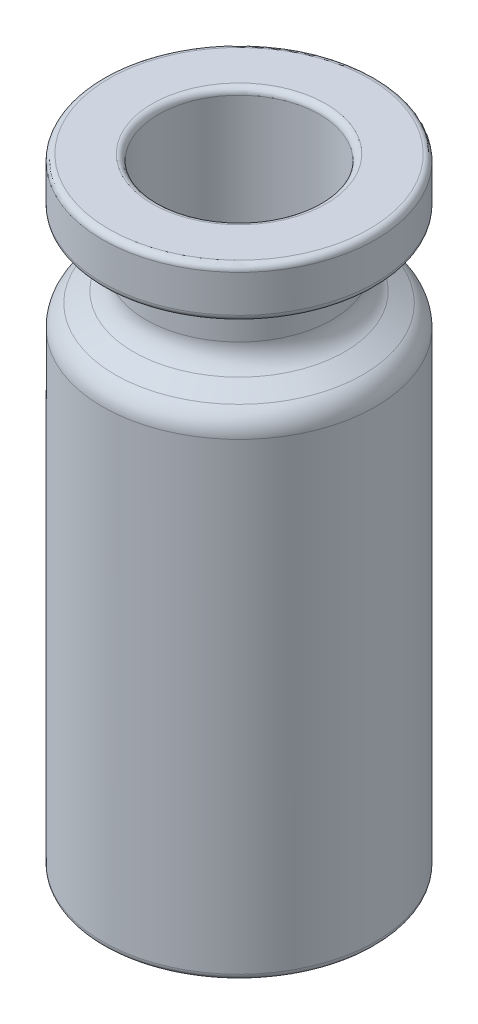
ISO-10303-21;
HEADER;
FILE_DESCRIPTION(('STEP AP214'),'2;1');
FILE_NAME('part.step','',(''),(''),'','','');
FILE_SCHEMA(('AUTOMOTIVE_DESIGN { 1 0 10303 214 1 1 1 1 }'));
ENDSEC;
DATA;
#1=APPLICATION_CONTEXT('core data for automotive mechanical design processes');
#2=APPLICATION_PROTOCOL_DEFINITION('international standard','automotive_design',2000,#1);
#3=PRODUCT_CONTEXT('',#1,'mechanical');
#4=PRODUCT('Part','Part','',(#3));
#5=PRODUCT_RELATED_PRODUCT_CATEGORY('part','',(#4));
#6=PRODUCT_DEFINITION_FORMATION('','',#4);
#7=PRODUCT_DEFINITION_CONTEXT('part definition',#1,'design');
#8=PRODUCT_DEFINITION('design','',#6,#7);
#9=PRODUCT_DEFINITION_SHAPE('','',#8);
#10=(LENGTH_UNIT() NAMED_UNIT(*) SI_UNIT(.MILLI.,.METRE.));
#11=(NAMED_UNIT(*) PLANE_ANGLE_UNIT() SI_UNIT($,.RADIAN.));
#12=(NAMED_UNIT(*) SI_UNIT($,.STERADIAN.) SOLID_ANGLE_UNIT());
#13=UNCERTAINTY_MEASURE_WITH_UNIT(LENGTH_MEASURE(1.E-05),#10,'distance_accuracy_value','');
#14=(GEOMETRIC_REPRESENTATION_CONTEXT(3) GLOBAL_UNCERTAINTY_ASSIGNED_CONTEXT((#13)) GLOBAL_UNIT_ASSIGNED_CONTEXT((#10,
#11,#12)) REPRESENTATION_CONTEXT('',''));
#15=CARTESIAN_POINT('',(0.,0.,0.));
#16=DIRECTION('',(0.,0.,1.));
#17=DIRECTION('',(1.,0.,0.));
#18=AXIS2_PLACEMENT_3D('',#15,#16,#17);
#19=CARTESIAN_POINT('',(0.,0.,0.));
#20=DIRECTION('',(0.,-1.,0.));
#21=DIRECTION('',(0.,0.,-1.));
#22=AXIS2_PLACEMENT_3D('',#19,#20,#21);
#23=PLANE('',#22);
#24=CARTESIAN_POINT('',(0.,0.,0.));
#25=DIRECTION('',(0.,-1.,0.));
#26=DIRECTION('',(0.,0.,-1.));
#27=AXIS2_PLACEMENT_3D('',#24,#25,#26);
#28=CIRCLE('',#27,10.5);
#29=CARTESIAN_POINT('',(0.,0.,-10.5));
#30=VERTEX_POINT('',#29);
#31=EDGE_CURVE('E78',#30,#30,#28,.T.);
#32=ORIENTED_EDGE('',*,*,#31,.T.);
#33=EDGE_LOOP('',(#32));
#34=FACE_BOUND('',#33,.T.);
#35=ADVANCED_FACE('F42',(#34),#23,.T.);
#36=CARTESIAN_POINT('',(0.,0.,0.));
#37=DIRECTION('',(0.,-1.,0.));
#38=DIRECTION('',(0.,0.,-1.));
#39=AXIS2_PLACEMENT_3D('',#36,#37,#38);
#40=CYLINDRICAL_SURFACE('',#39,11.);
#41=CARTESIAN_POINT('',(0.,0.5,0.));
#42=DIRECTION('',(0.,-1.,0.));
#43=DIRECTION('',(0.,0.,-1.));
#44=AXIS2_PLACEMENT_3D('',#41,#42,#43);
#45=CIRCLE('',#44,11.);
#46=CARTESIAN_POINT('',(0.,0.5,-11.));
#47=VERTEX_POINT('',#46);
#48=EDGE_CURVE('E74',#47,#47,#45,.F.);
#49=ORIENTED_EDGE('',*,*,#48,.T.);
#50=EDGE_LOOP('',(#49));
#51=FACE_BOUND('',#50,.T.);
#52=CARTESIAN_POINT('',(0.,37.8393549290575,0.));
#53=DIRECTION('',(0.,1.,0.));
#54=DIRECTION('',(0.,0.,1.));
#55=AXIS2_PLACEMENT_3D('',#52,#53,#54);
#56=CIRCLE('',#55,11.);
#57=CARTESIAN_POINT('',(0.,37.8393549290575,11.));
#58=VERTEX_POINT('',#57);
#59=EDGE_CURVE('E82',#58,#58,#56,.F.);
#60=ORIENTED_EDGE('',*,*,#59,.T.);
#61=EDGE_LOOP('',(#60));
#62=FACE_BOUND('',#61,.T.);
#63=ADVANCED_FACE('F136',(#51,#62),#40,.T.);
#64=CARTESIAN_POINT('',(0.,39.,0.));
#65=DIRECTION('',(0.,-1.,0.));
#66=DIRECTION('',(0.,0.,-1.));
#67=AXIS2_PLACEMENT_3D('',#64,#65,#66);
#68=CONICAL_SURFACE('',#67,11.,1.05165021254837);
#69=CARTESIAN_POINT('',(0.,40.4241587866935,0.));
#70=DIRECTION('',(0.,-1.,0.));
#71=DIRECTION('',(0.,0.,-1.));
#72=AXIS2_PLACEMENT_3D('',#69,#70,#71);
#73=CIRCLE('',#72,8.50772212328633);
#74=CARTESIAN_POINT('',(0.,40.4241587866935,-8.50772212328633));
#75=VERTEX_POINT('',#74);
#76=EDGE_CURVE('E86',#75,#75,#73,.T.);
#77=ORIENTED_EDGE('',*,*,#76,.T.);
#78=EDGE_LOOP('',(#77));
#79=FACE_BOUND('',#78,.T.);
#80=CARTESIAN_POINT('',(0.,39.5758412133065,0.));
#81=DIRECTION('',(0.,1.,0.));
#82=DIRECTION('',(0.,0.,1.));
#83=AXIS2_PLACEMENT_3D('',#80,#81,#82);
#84=CIRCLE('',#83,9.99227787671367);
#85=CARTESIAN_POINT('',(0.,39.5758412133065,9.99227787671367));
#86=VERTEX_POINT('',#85);
#87=EDGE_CURVE('E90',#86,#86,#84,.T.);
#88=ORIENTED_EDGE('',*,*,#87,.T.);
#89=EDGE_LOOP('',(#88));
#90=FACE_BOUND('',#89,.T.);
#91=ADVANCED_FACE('F142',(#79,#90),#68,.T.);
#92=CARTESIAN_POINT('',(0.,0.,0.));
#93=DIRECTION('',(0.,-1.,0.));
#94=DIRECTION('',(0.,0.,-1.));
#95=AXIS2_PLACEMENT_3D('',#92,#93,#94);
#96=CYLINDRICAL_SURFACE('',#95,7.5);
#97=CARTESIAN_POINT('',(0.,44.,0.));
#98=DIRECTION('',(0.,-1.,0.));
#99=DIRECTION('',(0.,0.,-1.));
#100=AXIS2_PLACEMENT_3D('',#97,#98,#99);
#101=CIRCLE('',#100,7.5);
#102=CARTESIAN_POINT('',(0.,44.,-7.5));
#103=VERTEX_POINT('',#102);
#104=EDGE_CURVE('E98',#103,#103,#101,.T.);
#105=ORIENTED_EDGE('',*,*,#104,.T.);
#106=EDGE_LOOP('',(#105));
#107=FACE_BOUND('',#106,.T.);
#108=CARTESIAN_POINT('',(0.,42.1606450709424,0.));
#109=DIRECTION('',(0.,-1.,0.));
#110=DIRECTION('',(0.,0.,-1.));
#111=AXIS2_PLACEMENT_3D('',#108,#109,#110);
#112=CIRCLE('',#111,7.5);
#113=CARTESIAN_POINT('',(0.,42.1606450709424,-7.5));
#114=VERTEX_POINT('',#113);
#115=EDGE_CURVE('E102',#114,#114,#112,.F.);
#116=ORIENTED_EDGE('',*,*,#115,.T.);
#117=EDGE_LOOP('',(#116));
#118=FACE_BOUND('',#117,.T.);
#119=ADVANCED_FACE('F175',(#107,#118),#96,.T.);
#120=CARTESIAN_POINT('',(7.5,46.,0.));
#121=DIRECTION('',(0.,-1.,0.));
#122=DIRECTION('',(0.,0.,-1.));
#123=AXIS2_PLACEMENT_3D('',#120,#121,#122);
#124=PLANE('',#123);
#125=CARTESIAN_POINT('',(0.,46.,0.));
#126=DIRECTION('',(0.,-1.,0.));
#127=DIRECTION('',(0.,0.,-1.));
#128=AXIS2_PLACEMENT_3D('',#125,#126,#127);
#129=CIRCLE('',#128,10.5);
#130=CARTESIAN_POINT('',(0.,46.,-10.5));
#131=VERTEX_POINT('',#130);
#132=EDGE_CURVE('E55',#131,#131,#129,.T.);
#133=ORIENTED_EDGE('',*,*,#132,.T.);
#134=EDGE_LOOP('',(#133));
#135=FACE_BOUND('',#134,.T.);
#136=CARTESIAN_POINT('',(0.,46.,0.));
#137=DIRECTION('',(0.,-1.,0.));
#138=DIRECTION('',(0.,0.,-1.));
#139=AXIS2_PLACEMENT_3D('',#136,#137,#138);
#140=CIRCLE('',#139,9.5);
#141=CARTESIAN_POINT('',(0.,46.,-9.5));
#142=VERTEX_POINT('',#141);
#143=EDGE_CURVE('E94',#142,#142,#140,.F.);
#144=ORIENTED_EDGE('',*,*,#143,.T.);
#145=EDGE_LOOP('',(#144));
#146=FACE_BOUND('',#145,.T.);
#147=ADVANCED_FACE('F171',(#135,#146),#124,.T.);
#148=CARTESIAN_POINT('',(0.,0.,0.));
#149=DIRECTION('',(0.,-1.,0.));
#150=DIRECTION('',(0.,0.,-1.));
#151=AXIS2_PLACEMENT_3D('',#148,#149,#150);
#152=CYLINDRICAL_SURFACE('',#151,11.);
#153=CARTESIAN_POINT('',(0.,46.5,0.));
#154=DIRECTION('',(0.,-1.,0.));
#155=DIRECTION('',(0.,0.,-1.));
#156=AXIS2_PLACEMENT_3D('',#153,#154,#155);
#157=CIRCLE('',#156,11.);
#158=CARTESIAN_POINT('',(0.,46.5,-11.));
#159=VERTEX_POINT('',#158);
#160=EDGE_CURVE('E10',#159,#159,#157,.F.);
#161=ORIENTED_EDGE('',*,*,#160,.T.);
#162=EDGE_LOOP('',(#161));
#163=FACE_BOUND('',#162,.T.);
#164=CARTESIAN_POINT('',(0.,49.5,0.));
#165=DIRECTION('',(0.,1.,0.));
#166=DIRECTION('',(0.,0.,1.));
#167=AXIS2_PLACEMENT_3D('',#164,#165,#166);
#168=CIRCLE('',#167,11.);
#169=CARTESIAN_POINT('',(0.,49.5,11.));
#170=VERTEX_POINT('',#169);
#171=EDGE_CURVE('E50',#170,#170,#168,.F.);
#172=ORIENTED_EDGE('',*,*,#171,.T.);
#173=EDGE_LOOP('',(#172));
#174=FACE_BOUND('',#173,.T.);
#175=ADVANCED_FACE('F174',(#163,#174),#152,.T.);
#176=CARTESIAN_POINT('',(11.,50.,0.));
#177=DIRECTION('',(0.,1.,0.));
#178=DIRECTION('',(0.,0.,1.));
#179=AXIS2_PLACEMENT_3D('',#176,#177,#178);
#180=PLANE('',#179);
#181=CARTESIAN_POINT('',(0.,50.,0.));
#182=DIRECTION('',(0.,1.,0.));
#183=DIRECTION('',(0.,0.,1.));
#184=AXIS2_PLACEMENT_3D('',#181,#182,#183);
#185=CIRCLE('',#184,7.);
#186=CARTESIAN_POINT('',(0.,50.,7.));
#187=VERTEX_POINT('',#186);
#188=EDGE_CURVE('E66',#187,#187,#185,.F.);
#189=ORIENTED_EDGE('',*,*,#188,.T.);
#190=EDGE_LOOP('',(#189));
#191=FACE_BOUND('',#190,.T.);
#192=CARTESIAN_POINT('',(0.,50.,0.));
#193=DIRECTION('',(0.,1.,0.));
#194=DIRECTION('',(0.,0.,1.));
#195=AXIS2_PLACEMENT_3D('',#192,#193,#194);
#196=CIRCLE('',#195,10.5);
#197=CARTESIAN_POINT('',(0.,50.,10.5));
#198=VERTEX_POINT('',#197);
#199=EDGE_CURVE('E70',#198,#198,#196,.T.);
#200=ORIENTED_EDGE('',*,*,#199,.T.);
#201=EDGE_LOOP('',(#200));
#202=FACE_BOUND('',#201,.T.);
#203=ADVANCED_FACE('F199',(#191,#202),#180,.T.);
#204=CARTESIAN_POINT('',(0.,0.,0.));
#205=DIRECTION('',(0.,-1.,0.));
#206=DIRECTION('',(0.,0.,-1.));
#207=AXIS2_PLACEMENT_3D('',#204,#205,#206);
#208=CYLINDRICAL_SURFACE('',#207,6.5);
#209=CARTESIAN_POINT('',(0.,49.5,0.));
#210=DIRECTION('',(0.,1.,0.));
#211=DIRECTION('',(0.,0.,1.));
#212=AXIS2_PLACEMENT_3D('',#209,#210,#211);
#213=CIRCLE('',#212,6.5);
#214=CARTESIAN_POINT('',(0.,49.5,6.5));
#215=VERTEX_POINT('',#214);
#216=EDGE_CURVE('E60',#215,#215,#213,.T.);
#217=ORIENTED_EDGE('',*,*,#216,.T.);
#218=EDGE_LOOP('',(#217));
#219=FACE_BOUND('',#218,.T.);
#220=CARTESIAN_POINT('',(0.,40.4196774645288,0.));
#221=DIRECTION('',(0.,-1.,0.));
#222=DIRECTION('',(0.,0.,-1.));
#223=AXIS2_PLACEMENT_3D('',#220,#221,#222);
#224=CIRCLE('',#223,6.5);
#225=CARTESIAN_POINT('',(0.,40.4196774645288,-6.5));
#226=VERTEX_POINT('',#225);
#227=EDGE_CURVE('E106',#226,#226,#224,.T.);
#228=ORIENTED_EDGE('',*,*,#227,.T.);
#229=EDGE_LOOP('',(#228));
#230=FACE_BOUND('',#229,.T.);
#231=ADVANCED_FACE('F202',(#219,#230),#208,.F.);
#232=CARTESIAN_POINT('',(0.,40.4196774645288,0.));
#233=DIRECTION('',(0.,-1.,0.));
#234=DIRECTION('',(0.,0.,-1.));
#235=AXIS2_PLACEMENT_3D('',#232,#233,#234);
#236=CONICAL_SURFACE('',#235,6.5,1.05165021254837);
#237=CARTESIAN_POINT('',(0.,38.4196774645288,0.));
#238=DIRECTION('',(0.,-1.,0.));
#239=DIRECTION('',(0.,0.,-1.));
#240=AXIS2_PLACEMENT_3D('',#237,#238,#239);
#241=CIRCLE('',#240,9.99999999999999);
#242=CARTESIAN_POINT('',(0.,38.4196774645288,-9.99999999999999));
#243=VERTEX_POINT('',#242);
#244=EDGE_CURVE('E110',#243,#243,#241,.T.);
#245=ORIENTED_EDGE('',*,*,#244,.T.);
#246=EDGE_LOOP('',(#245));
#247=FACE_BOUND('',#246,.T.);
#248=ORIENTED_EDGE('',*,*,#227,.F.);
#249=EDGE_LOOP('',(#248));
#250=FACE_BOUND('',#249,.T.);
#251=ADVANCED_FACE('F133',(#247,#250),#236,.F.);
#252=CARTESIAN_POINT('',(0.,0.,0.));
#253=DIRECTION('',(0.,-1.,0.));
#254=DIRECTION('',(0.,0.,-1.));
#255=AXIS2_PLACEMENT_3D('',#252,#253,#254);
#256=CYLINDRICAL_SURFACE('',#255,9.99999999999999);
#257=CARTESIAN_POINT('',(0.,1.,0.));
#258=DIRECTION('',(0.,-1.,0.));
#259=DIRECTION('',(0.,0.,-1.));
#260=AXIS2_PLACEMENT_3D('',#257,#258,#259);
#261=CIRCLE('',#260,9.99999999999999);
#262=CARTESIAN_POINT('',(0.,1.,-9.99999999999999));
#263=VERTEX_POINT('',#262);
#264=EDGE_CURVE('E114',#263,#263,#261,.T.);
#265=ORIENTED_EDGE('',*,*,#264,.T.);
#266=EDGE_LOOP('',(#265));
#267=FACE_BOUND('',#266,.T.);
#268=ORIENTED_EDGE('',*,*,#244,.F.);
#269=EDGE_LOOP('',(#268));
#270=FACE_BOUND('',#269,.T.);
#271=ADVANCED_FACE('F119',(#267,#270),#256,.F.);
#272=CARTESIAN_POINT('',(9.99999999999999,1.,0.));
#273=DIRECTION('',(0.,1.,0.));
#274=DIRECTION('',(0.,0.,1.));
#275=AXIS2_PLACEMENT_3D('',#272,#273,#274);
#276=PLANE('',#275);
#277=ORIENTED_EDGE('',*,*,#264,.F.);
#278=EDGE_LOOP('',(#277));
#279=FACE_BOUND('',#278,.T.);
#280=ADVANCED_FACE('F122',(#279),#276,.T.);
#281=CARTESIAN_POINT('',(0.,44.,0.));
#282=DIRECTION('',(0.,-1.,0.));
#283=DIRECTION('',(0.,0.,-1.));
#284=AXIS2_PLACEMENT_3D('',#281,#282,#283);
#285=TOROIDAL_SURFACE('',#284,9.5,2.);
#286=ORIENTED_EDGE('',*,*,#143,.F.);
#287=EDGE_LOOP('',(#286));
#288=FACE_BOUND('',#287,.T.);
#289=ORIENTED_EDGE('',*,*,#104,.F.);
#290=EDGE_LOOP('',(#289));
#291=FACE_BOUND('',#290,.T.);
#292=ADVANCED_FACE('F124',(#288,#291),#285,.F.);
#293=CARTESIAN_POINT('',(0.,42.1606450709424,0.));
#294=DIRECTION('',(0.,-1.,0.));
#295=DIRECTION('',(0.,0.,-1.));
#296=AXIS2_PLACEMENT_3D('',#293,#294,#295);
#297=TOROIDAL_SURFACE('',#296,9.5,2.);
#298=ORIENTED_EDGE('',*,*,#115,.F.);
#299=EDGE_LOOP('',(#298));
#300=FACE_BOUND('',#299,.T.);
#301=ORIENTED_EDGE('',*,*,#76,.F.);
#302=EDGE_LOOP('',(#301));
#303=FACE_BOUND('',#302,.T.);
#304=ADVANCED_FACE('F130',(#300,#303),#297,.F.);
#305=CARTESIAN_POINT('',(0.,37.8393549290575,0.));
#306=DIRECTION('',(0.,1.,0.));
#307=DIRECTION('',(0.,0.,1.));
#308=AXIS2_PLACEMENT_3D('',#305,#306,#307);
#309=TOROIDAL_SURFACE('',#308,8.99999999999999,2.);
#310=ORIENTED_EDGE('',*,*,#87,.F.);
#311=EDGE_LOOP('',(#310));
#312=FACE_BOUND('',#311,.T.);
#313=ORIENTED_EDGE('',*,*,#59,.F.);
#314=EDGE_LOOP('',(#313));
#315=FACE_BOUND('',#314,.T.);
#316=ADVANCED_FACE('F149',(#312,#315),#309,.T.);
#317=CARTESIAN_POINT('',(0.,0.5,0.));
#318=DIRECTION('',(0.,-1.,0.));
#319=DIRECTION('',(0.,0.,-1.));
#320=AXIS2_PLACEMENT_3D('',#317,#318,#319);
#321=TOROIDAL_SURFACE('',#320,10.5,0.5);
#322=ORIENTED_EDGE('',*,*,#48,.F.);
#323=EDGE_LOOP('',(#322));
#324=FACE_BOUND('',#323,.T.);
#325=ORIENTED_EDGE('',*,*,#31,.F.);
#326=EDGE_LOOP('',(#325));
#327=FACE_BOUND('',#326,.T.);
#328=ADVANCED_FACE('F153',(#324,#327),#321,.T.);
#329=CARTESIAN_POINT('',(0.,49.5,0.));
#330=DIRECTION('',(0.,1.,0.));
#331=DIRECTION('',(0.,0.,1.));
#332=AXIS2_PLACEMENT_3D('',#329,#330,#331);
#333=TOROIDAL_SURFACE('',#332,7.,0.5);
#334=ORIENTED_EDGE('',*,*,#216,.F.);
#335=EDGE_LOOP('',(#334));
#336=FACE_BOUND('',#335,.T.);
#337=ORIENTED_EDGE('',*,*,#188,.F.);
#338=EDGE_LOOP('',(#337));
#339=FACE_BOUND('',#338,.T.);
#340=ADVANCED_FACE('F157',(#336,#339),#333,.T.);
#341=CARTESIAN_POINT('',(0.,46.5,0.));
#342=DIRECTION('',(0.,-1.,0.));
#343=DIRECTION('',(0.,0.,-1.));
#344=AXIS2_PLACEMENT_3D('',#341,#342,#343);
#345=TOROIDAL_SURFACE('',#344,10.5,0.5);
#346=ORIENTED_EDGE('',*,*,#160,.F.);
#347=EDGE_LOOP('',(#346));
#348=FACE_BOUND('',#347,.T.);
#349=ORIENTED_EDGE('',*,*,#132,.F.);
#350=EDGE_LOOP('',(#349));
#351=FACE_BOUND('',#350,.T.);
#352=ADVANCED_FACE('F160',(#348,#351),#345,.T.);
#353=CARTESIAN_POINT('',(0.,49.5,0.));
#354=DIRECTION('',(0.,1.,0.));
#355=DIRECTION('',(0.,0.,1.));
#356=AXIS2_PLACEMENT_3D('',#353,#354,#355);
#357=TOROIDAL_SURFACE('',#356,10.5,0.5);
#358=ORIENTED_EDGE('',*,*,#199,.F.);
#359=EDGE_LOOP('',(#358));
#360=FACE_BOUND('',#359,.T.);
#361=ORIENTED_EDGE('',*,*,#171,.F.);
#362=EDGE_LOOP('',(#361));
#363=FACE_BOUND('',#362,.T.);
#364=ADVANCED_FACE('F44',(#360,#363),#357,.T.);
#365=CLOSED_SHELL('',(#35,#63,#91,#119,#147,#175,#203,#231,#251,#271,#280,#292,#304,#316,#328,
#340,#352,#364));
#366=MANIFOLD_SOLID_BREP('B2',#365);
#367=ADVANCED_BREP_SHAPE_REPRESENTATION('',(#18,#366),#14);
#368=SHAPE_DEFINITION_REPRESENTATION(#9,#367);
ENDSEC;
END-ISO-10303-21;
